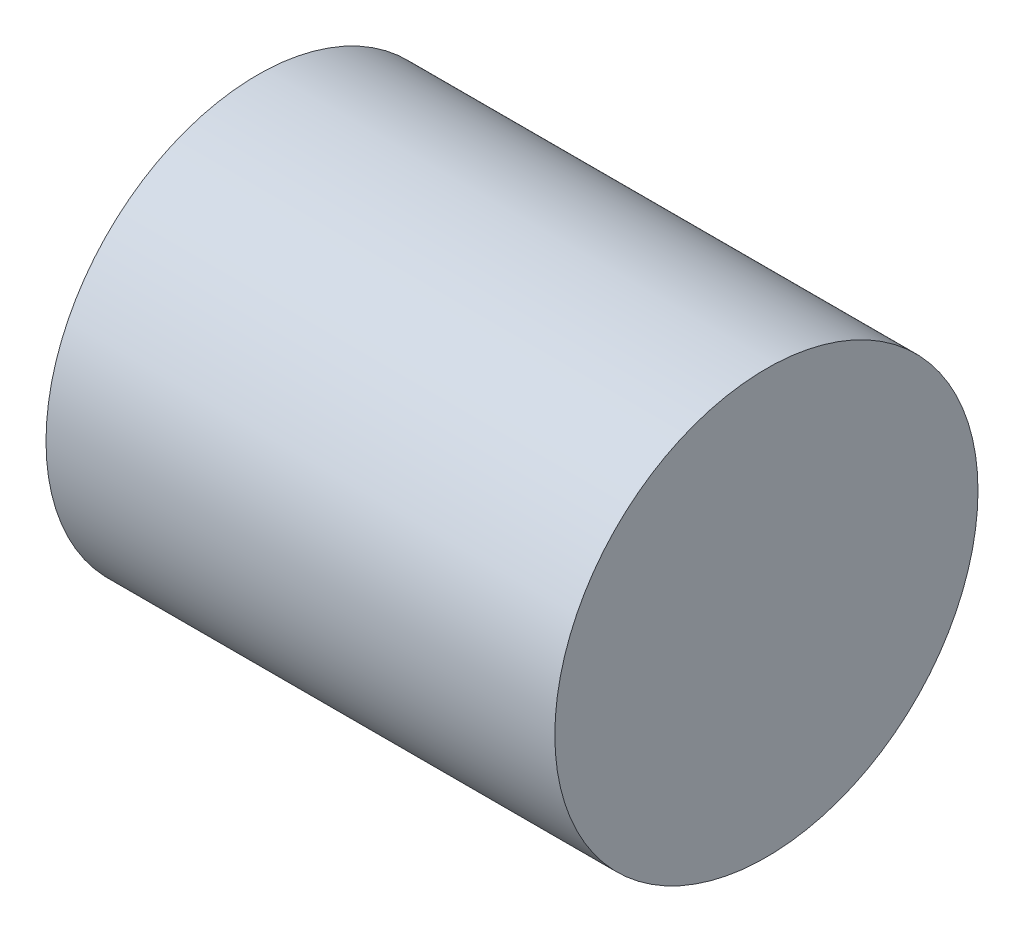
ISO-10303-21;
HEADER;
FILE_DESCRIPTION(('STEP AP214'),'2;1');
FILE_NAME('part.step','',(''),(''),'','','');
FILE_SCHEMA(('AUTOMOTIVE_DESIGN { 1 0 10303 214 1 1 1 1 }'));
ENDSEC;
DATA;
#1=APPLICATION_CONTEXT('core data for automotive mechanical design processes');
#2=APPLICATION_PROTOCOL_DEFINITION('international standard','automotive_design',2000,#1);
#3=PRODUCT_CONTEXT('',#1,'mechanical');
#4=PRODUCT('Part','Part','',(#3));
#5=PRODUCT_RELATED_PRODUCT_CATEGORY('part','',(#4));
#6=PRODUCT_DEFINITION_FORMATION('','',#4);
#7=PRODUCT_DEFINITION_CONTEXT('part definition',#1,'design');
#8=PRODUCT_DEFINITION('design','',#6,#7);
#9=PRODUCT_DEFINITION_SHAPE('','',#8);
#10=(LENGTH_UNIT() NAMED_UNIT(*) SI_UNIT(.MILLI.,.METRE.));
#11=(NAMED_UNIT(*) PLANE_ANGLE_UNIT() SI_UNIT($,.RADIAN.));
#12=(NAMED_UNIT(*) SI_UNIT($,.STERADIAN.) SOLID_ANGLE_UNIT());
#13=UNCERTAINTY_MEASURE_WITH_UNIT(LENGTH_MEASURE(1.E-05),#10,'distance_accuracy_value','');
#14=(GEOMETRIC_REPRESENTATION_CONTEXT(3) GLOBAL_UNCERTAINTY_ASSIGNED_CONTEXT((#13)) GLOBAL_UNIT_ASSIGNED_CONTEXT((#10,
#11,#12)) REPRESENTATION_CONTEXT('',''));
#15=CARTESIAN_POINT('',(0.,0.,0.));
#16=DIRECTION('',(0.,0.,1.));
#17=DIRECTION('',(1.,0.,0.));
#18=AXIS2_PLACEMENT_3D('',#15,#16,#17);
#19=CARTESIAN_POINT('',(12.,0.,0.));
#20=DIRECTION('',(-1.,0.,0.));
#21=DIRECTION('',(0.,0.,1.));
#22=AXIS2_PLACEMENT_3D('',#19,#20,#21);
#23=CYLINDRICAL_SURFACE('',#22,4.99);
#24=CARTESIAN_POINT('',(12.,0.,0.));
#25=DIRECTION('',(1.,0.,0.));
#26=DIRECTION('',(0.,0.,-1.));
#27=AXIS2_PLACEMENT_3D('',#24,#25,#26);
#28=CIRCLE('',#27,4.99);
#29=CARTESIAN_POINT('',(12.,0.,-4.99));
#30=VERTEX_POINT('',#29);
#31=EDGE_CURVE('E10',#30,#30,#28,.T.);
#32=ORIENTED_EDGE('',*,*,#31,.F.);
#33=EDGE_LOOP('',(#32));
#34=FACE_BOUND('',#33,.T.);
#35=CARTESIAN_POINT('',(0.,0.,0.));
#36=DIRECTION('',(1.,0.,0.));
#37=DIRECTION('',(0.,0.,-1.));
#38=AXIS2_PLACEMENT_3D('',#35,#36,#37);
#39=CIRCLE('',#38,4.99);
#40=CARTESIAN_POINT('',(0.,0.,-4.99));
#41=VERTEX_POINT('',#40);
#42=EDGE_CURVE('E40',#41,#41,#39,.T.);
#43=ORIENTED_EDGE('',*,*,#42,.T.);
#44=EDGE_LOOP('',(#43));
#45=FACE_BOUND('',#44,.T.);
#46=ADVANCED_FACE('F37',(#34,#45),#23,.T.);
#47=CARTESIAN_POINT('',(12.,0.,0.));
#48=DIRECTION('',(1.,0.,0.));
#49=DIRECTION('',(0.,0.,-1.));
#50=AXIS2_PLACEMENT_3D('',#47,#48,#49);
#51=PLANE('',#50);
#52=ORIENTED_EDGE('',*,*,#31,.T.);
#53=EDGE_LOOP('',(#52));
#54=FACE_BOUND('',#53,.T.);
#55=ADVANCED_FACE('F52',(#54),#51,.T.);
#56=CARTESIAN_POINT('',(0.,0.,0.));
#57=DIRECTION('',(1.,0.,0.));
#58=DIRECTION('',(0.,0.,-1.));
#59=AXIS2_PLACEMENT_3D('',#56,#57,#58);
#60=PLANE('',#59);
#61=ORIENTED_EDGE('',*,*,#42,.F.);
#62=EDGE_LOOP('',(#61));
#63=FACE_BOUND('',#62,.T.);
#64=ADVANCED_FACE('F50',(#63),#60,.F.);
#65=CLOSED_SHELL('',(#46,#55,#64));
#66=MANIFOLD_SOLID_BREP('B2',#65);
#67=ADVANCED_BREP_SHAPE_REPRESENTATION('',(#18,#66),#14);
#68=SHAPE_DEFINITION_REPRESENTATION(#9,#67);
ENDSEC;
END-ISO-10303-21;
